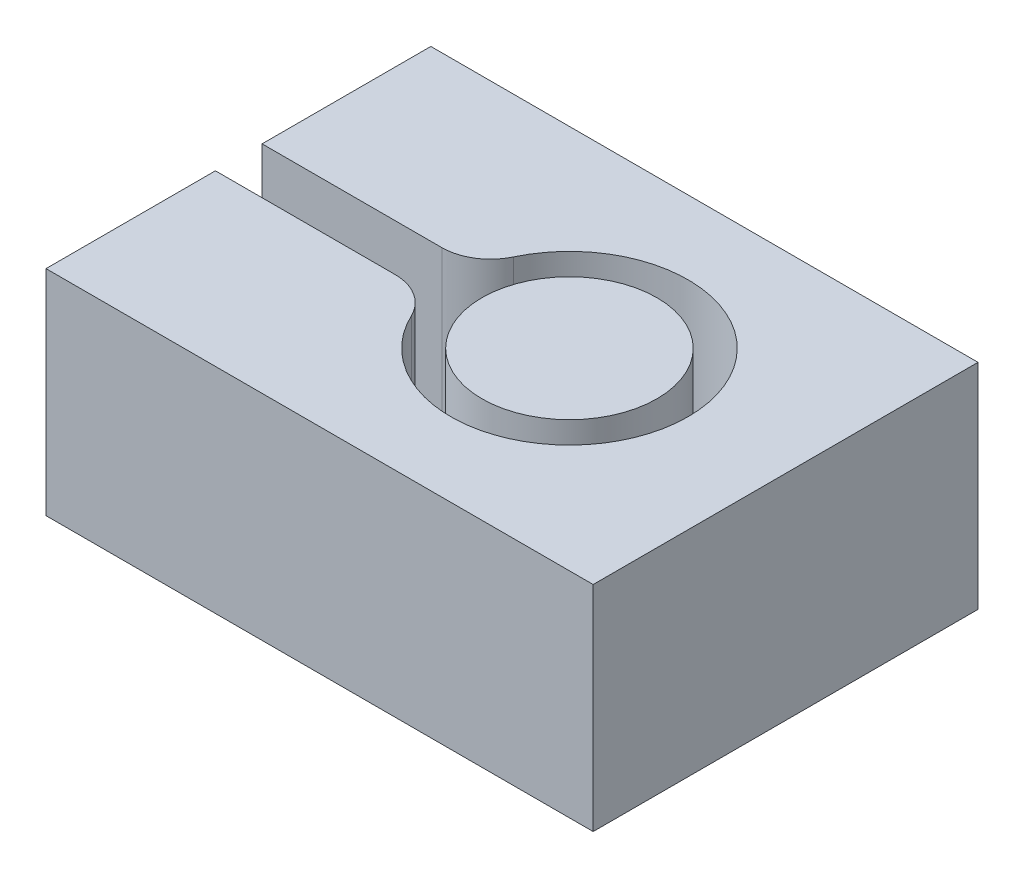
ISO-10303-21;
HEADER;
FILE_DESCRIPTION(('STEP AP214'),'2;1');
FILE_NAME('part.step','',(''),(''),'','','');
FILE_SCHEMA(('AUTOMOTIVE_DESIGN { 1 0 10303 214 1 1 1 1 }'));
ENDSEC;
DATA;
#1=APPLICATION_CONTEXT('core data for automotive mechanical design processes');
#2=APPLICATION_PROTOCOL_DEFINITION('international standard','automotive_design',2000,#1);
#3=PRODUCT_CONTEXT('',#1,'mechanical');
#4=PRODUCT('Part','Part','',(#3));
#5=PRODUCT_RELATED_PRODUCT_CATEGORY('part','',(#4));
#6=PRODUCT_DEFINITION_FORMATION('','',#4);
#7=PRODUCT_DEFINITION_CONTEXT('part definition',#1,'design');
#8=PRODUCT_DEFINITION('design','',#6,#7);
#9=PRODUCT_DEFINITION_SHAPE('','',#8);
#10=(LENGTH_UNIT() NAMED_UNIT(*) SI_UNIT(.MILLI.,.METRE.));
#11=(NAMED_UNIT(*) PLANE_ANGLE_UNIT() SI_UNIT($,.RADIAN.));
#12=(NAMED_UNIT(*) SI_UNIT($,.STERADIAN.) SOLID_ANGLE_UNIT());
#13=UNCERTAINTY_MEASURE_WITH_UNIT(LENGTH_MEASURE(1.E-05),#10,'distance_accuracy_value','');
#14=(GEOMETRIC_REPRESENTATION_CONTEXT(3) GLOBAL_UNCERTAINTY_ASSIGNED_CONTEXT((#13)) GLOBAL_UNIT_ASSIGNED_CONTEXT((#10,
#11,#12)) REPRESENTATION_CONTEXT('',''));
#15=CARTESIAN_POINT('',(0.,0.,0.));
#16=DIRECTION('',(0.,0.,1.));
#17=DIRECTION('',(1.,0.,0.));
#18=AXIS2_PLACEMENT_3D('',#15,#16,#17);
#19=CARTESIAN_POINT('',(0.,0.,0.));
#20=DIRECTION('',(0.,-1.,0.));
#21=DIRECTION('',(0.,0.,-1.));
#22=AXIS2_PLACEMENT_3D('',#19,#20,#21);
#23=PLANE('',#22);
#24=CARTESIAN_POINT('',(17.,0.,-9.90872659824433));
#25=DIRECTION('',(0.,-1.,0.));
#26=DIRECTION('',(0.,0.,-1.));
#27=AXIS2_PLACEMENT_3D('',#24,#25,#26);
#28=CIRCLE('',#27,4.5);
#29=CARTESIAN_POINT('',(17.,0.,-14.4087265982443));
#30=VERTEX_POINT('',#29);
#31=EDGE_CURVE('E12',#30,#30,#28,.F.);
#32=ORIENTED_EDGE('',*,*,#31,.F.);
#33=EDGE_LOOP('',(#32));
#34=FACE_BOUND('',#33,.T.);
#35=DIRECTION('',(1.,0.,0.));
#36=VECTOR('',#35,1.);
#37=CARTESIAN_POINT('',(0.,0.,-8.70872659824433));
#38=LINE('',#37,#36);
#39=CARTESIAN_POINT('',(0.,0.,-8.70872659824433));
#40=VERTEX_POINT('',#39);
#41=CARTESIAN_POINT('',(9.23662444551341,0.,-8.70872659824433));
#42=VERTEX_POINT('',#41);
#43=EDGE_CURVE('E83',#40,#42,#38,.T.);
#44=ORIENTED_EDGE('',*,*,#43,.T.);
#45=CARTESIAN_POINT('',(9.23662444551341,0.,-6.20872659824433));
#46=DIRECTION('',(0.,-1.,0.));
#47=DIRECTION('',(0.,0.,-1.));
#48=AXIS2_PLACEMENT_3D('',#45,#46,#47);
#49=CIRCLE('',#48,2.5);
#50=CARTESIAN_POINT('',(11.4934196648409,0.,-7.28430799359317));
#51=VERTEX_POINT('',#50);
#52=EDGE_CURVE('E173',#51,#42,#49,.F.);
#53=ORIENTED_EDGE('',*,*,#52,.F.);
#54=CARTESIAN_POINT('',(17.,0.,-9.90872659824433));
#55=DIRECTION('',(0.,1.,0.));
#56=DIRECTION('',(0.,0.,1.));
#57=AXIS2_PLACEMENT_3D('',#54,#55,#56);
#58=CIRCLE('',#57,6.1);
#59=CARTESIAN_POINT('',(11.4934196648409,0.,-12.5331452028955));
#60=VERTEX_POINT('',#59);
#61=EDGE_CURVE('E219',#51,#60,#58,.T.);
#62=ORIENTED_EDGE('',*,*,#61,.T.);
#63=CARTESIAN_POINT('',(9.23662444551341,0.,-13.6087265982443));
#64=DIRECTION('',(0.,-1.,0.));
#65=DIRECTION('',(0.,0.,-1.));
#66=AXIS2_PLACEMENT_3D('',#63,#64,#65);
#67=CIRCLE('',#66,2.5);
#68=CARTESIAN_POINT('',(9.23662444551341,0.,-11.1087265982443));
#69=VERTEX_POINT('',#68);
#70=EDGE_CURVE('E181',#60,#69,#67,.T.);
#71=ORIENTED_EDGE('',*,*,#70,.T.);
#72=DIRECTION('',(1.,0.,0.));
#73=VECTOR('',#72,1.);
#74=CARTESIAN_POINT('',(0.,0.,-11.1087265982443));
#75=LINE('',#74,#73);
#76=CARTESIAN_POINT('',(0.,0.,-11.1087265982443));
#77=VERTEX_POINT('',#76);
#78=EDGE_CURVE('E186',#77,#69,#75,.T.);
#79=ORIENTED_EDGE('',*,*,#78,.F.);
#80=DIRECTION('',(0.,0.,-1.));
#81=VECTOR('',#80,1.);
#82=CARTESIAN_POINT('',(0.,0.,-19.7830272925356));
#83=LINE('',#82,#81);
#84=EDGE_CURVE('E88',#40,#77,#83,.T.);
#85=ORIENTED_EDGE('',*,*,#84,.F.);
#86=EDGE_LOOP('',(#44,#53,#62,#71,#79,#85));
#87=FACE_BOUND('',#86,.T.);
#88=ADVANCED_FACE('F68',(#34,#87),#23,.F.);
#89=CARTESIAN_POINT('',(17.,8.,-9.90872659824433));
#90=DIRECTION('',(0.,-1.,0.));
#91=DIRECTION('',(0.,0.,-1.));
#92=AXIS2_PLACEMENT_3D('',#89,#90,#91);
#93=CYLINDRICAL_SURFACE('',#92,6.1);
#94=ORIENTED_EDGE('',*,*,#61,.F.);
#95=DIRECTION('',(0.,1.,0.));
#96=VECTOR('',#95,1.);
#97=CARTESIAN_POINT('',(11.4934196648409,-11.8382282343721,-7.28430799359317));
#98=LINE('',#97,#96);
#99=CARTESIAN_POINT('',(11.4934196648409,8.,-7.28430799359317));
#100=VERTEX_POINT('',#99);
#101=EDGE_CURVE('E166',#51,#100,#98,.T.);
#102=ORIENTED_EDGE('',*,*,#101,.T.);
#103=CARTESIAN_POINT('',(17.,8.,-9.90872659824433));
#104=DIRECTION('',(0.,1.,0.));
#105=DIRECTION('',(0.,0.,1.));
#106=AXIS2_PLACEMENT_3D('',#103,#104,#105);
#107=CIRCLE('',#106,6.1);
#108=CARTESIAN_POINT('',(11.4934196648409,8.,-12.5331452028955));
#109=VERTEX_POINT('',#108);
#110=EDGE_CURVE('E153',#100,#109,#107,.T.);
#111=ORIENTED_EDGE('',*,*,#110,.T.);
#112=DIRECTION('',(0.,1.,0.));
#113=VECTOR('',#112,1.);
#114=CARTESIAN_POINT('',(11.4934196648409,-11.8382282343721,-12.5331452028955));
#115=LINE('',#114,#113);
#116=EDGE_CURVE('E169',#60,#109,#115,.T.);
#117=ORIENTED_EDGE('',*,*,#116,.F.);
#118=EDGE_LOOP('',(#94,#102,#111,#117));
#119=FACE_BOUND('',#118,.T.);
#120=ADVANCED_FACE('F70',(#119),#93,.F.);
#121=CARTESIAN_POINT('',(0.,8.,0.));
#122=DIRECTION('',(0.,0.,-1.));
#123=DIRECTION('',(-1.,0.,0.));
#124=AXIS2_PLACEMENT_3D('',#121,#122,#123);
#125=PLANE('',#124);
#126=DIRECTION('',(0.,-1.,0.));
#127=VECTOR('',#126,1.);
#128=CARTESIAN_POINT('',(0.,8.,0.));
#129=LINE('',#128,#127);
#130=CARTESIAN_POINT('',(0.,8.,0.));
#131=VERTEX_POINT('',#130);
#132=CARTESIAN_POINT('',(0.,-3.,0.));
#133=VERTEX_POINT('',#132);
#134=EDGE_CURVE('E76',#131,#133,#129,.T.);
#135=ORIENTED_EDGE('',*,*,#134,.T.);
#136=DIRECTION('',(-1.,0.,0.));
#137=VECTOR('',#136,1.);
#138=CARTESIAN_POINT('',(25.1281470654807,-3.,0.));
#139=LINE('',#138,#137);
#140=CARTESIAN_POINT('',(28.1281470654807,-3.,0.));
#141=VERTEX_POINT('',#140);
#142=EDGE_CURVE('E211',#141,#133,#139,.T.);
#143=ORIENTED_EDGE('',*,*,#142,.F.);
#144=DIRECTION('',(0.,-1.,0.));
#145=VECTOR('',#144,1.);
#146=CARTESIAN_POINT('',(28.1281470654807,8.,0.));
#147=LINE('',#146,#145);
#148=CARTESIAN_POINT('',(28.1281470654807,8.,0.));
#149=VERTEX_POINT('',#148);
#150=EDGE_CURVE('E199',#149,#141,#147,.T.);
#151=ORIENTED_EDGE('',*,*,#150,.F.);
#152=DIRECTION('',(1.,0.,0.));
#153=VECTOR('',#152,1.);
#154=CARTESIAN_POINT('',(0.,8.,0.));
#155=LINE('',#154,#153);
#156=EDGE_CURVE('E152',#131,#149,#155,.T.);
#157=ORIENTED_EDGE('',*,*,#156,.F.);
#158=EDGE_LOOP('',(#135,#143,#151,#157));
#159=FACE_BOUND('',#158,.T.);
#160=ADVANCED_FACE('F228',(#159),#125,.F.);
#161=CARTESIAN_POINT('',(0.,8.,-19.7830272925356));
#162=DIRECTION('',(0.,0.,-1.));
#163=DIRECTION('',(-1.,0.,0.));
#164=AXIS2_PLACEMENT_3D('',#161,#162,#163);
#165=PLANE('',#164);
#166=DIRECTION('',(1.,0.,0.));
#167=VECTOR('',#166,1.);
#168=CARTESIAN_POINT('',(0.,8.,-19.7830272925356));
#169=LINE('',#168,#167);
#170=CARTESIAN_POINT('',(0.,8.,-19.7830272925356));
#171=VERTEX_POINT('',#170);
#172=CARTESIAN_POINT('',(28.1281470654807,8.,-19.7830272925356));
#173=VERTEX_POINT('',#172);
#174=EDGE_CURVE('E223',#171,#173,#169,.T.);
#175=ORIENTED_EDGE('',*,*,#174,.T.);
#176=DIRECTION('',(0.,1.,0.));
#177=VECTOR('',#176,1.);
#178=CARTESIAN_POINT('',(28.1281470654807,-3.,-19.7830272925356));
#179=LINE('',#178,#177);
#180=CARTESIAN_POINT('',(28.1281470654807,-3.,-19.7830272925356));
#181=VERTEX_POINT('',#180);
#182=EDGE_CURVE('E205',#181,#173,#179,.T.);
#183=ORIENTED_EDGE('',*,*,#182,.F.);
#184=DIRECTION('',(1.,0.,0.));
#185=VECTOR('',#184,1.);
#186=CARTESIAN_POINT('',(25.1281470654807,-3.,-19.7830272925356));
#187=LINE('',#186,#185);
#188=CARTESIAN_POINT('',(0.,-3.,-19.7830272925356));
#189=VERTEX_POINT('',#188);
#190=EDGE_CURVE('E217',#189,#181,#187,.T.);
#191=ORIENTED_EDGE('',*,*,#190,.F.);
#192=DIRECTION('',(0.,-1.,0.));
#193=VECTOR('',#192,1.);
#194=CARTESIAN_POINT('',(0.,8.,-19.7830272925356));
#195=LINE('',#194,#193);
#196=EDGE_CURVE('E226',#171,#189,#195,.T.);
#197=ORIENTED_EDGE('',*,*,#196,.F.);
#198=EDGE_LOOP('',(#175,#183,#191,#197));
#199=FACE_BOUND('',#198,.T.);
#200=ADVANCED_FACE('F237',(#199),#165,.T.);
#201=CARTESIAN_POINT('',(0.,8.,0.));
#202=DIRECTION('',(1.,0.,0.));
#203=DIRECTION('',(0.,0.,-1.));
#204=AXIS2_PLACEMENT_3D('',#201,#202,#203);
#205=PLANE('',#204);
#206=ORIENTED_EDGE('',*,*,#196,.T.);
#207=DIRECTION('',(0.,0.,-1.));
#208=VECTOR('',#207,1.);
#209=CARTESIAN_POINT('',(0.,-3.,-19.7830272925356));
#210=LINE('',#209,#208);
#211=EDGE_CURVE('E214',#133,#189,#210,.T.);
#212=ORIENTED_EDGE('',*,*,#211,.F.);
#213=ORIENTED_EDGE('',*,*,#134,.F.);
#214=DIRECTION('',(0.,0.,1.));
#215=VECTOR('',#214,1.);
#216=CARTESIAN_POINT('',(0.,8.,0.));
#217=LINE('',#216,#215);
#218=CARTESIAN_POINT('',(0.,8.,-8.70872659824433));
#219=VERTEX_POINT('',#218);
#220=EDGE_CURVE('E144',#219,#131,#217,.T.);
#221=ORIENTED_EDGE('',*,*,#220,.F.);
#222=DIRECTION('',(0.,1.,0.));
#223=VECTOR('',#222,1.);
#224=CARTESIAN_POINT('',(0.,-11.8382282343721,-8.70872659824433));
#225=LINE('',#224,#223);
#226=EDGE_CURVE('E147',#40,#219,#225,.T.);
#227=ORIENTED_EDGE('',*,*,#226,.F.);
#228=ORIENTED_EDGE('',*,*,#84,.T.);
#229=DIRECTION('',(0.,1.,0.));
#230=VECTOR('',#229,1.);
#231=CARTESIAN_POINT('',(0.,-11.8382282343721,-11.1087265982443));
#232=LINE('',#231,#230);
#233=CARTESIAN_POINT('',(0.,8.,-11.1087265982443));
#234=VERTEX_POINT('',#233);
#235=EDGE_CURVE('E182',#77,#234,#232,.T.);
#236=ORIENTED_EDGE('',*,*,#235,.T.);
#237=EDGE_CURVE('E155',#171,#234,#217,.T.);
#238=ORIENTED_EDGE('',*,*,#237,.F.);
#239=EDGE_LOOP('',(#206,#212,#213,#221,#227,#228,#236,#238));
#240=FACE_BOUND('',#239,.T.);
#241=ADVANCED_FACE('F146',(#240),#205,.F.);
#242=CARTESIAN_POINT('',(0.,8.,0.));
#243=DIRECTION('',(0.,1.,0.));
#244=DIRECTION('',(0.,0.,1.));
#245=AXIS2_PLACEMENT_3D('',#242,#243,#244);
#246=PLANE('',#245);
#247=ORIENTED_EDGE('',*,*,#237,.T.);
#248=DIRECTION('',(1.,0.,0.));
#249=VECTOR('',#248,1.);
#250=CARTESIAN_POINT('',(0.,8.,-11.1087265982443));
#251=LINE('',#250,#249);
#252=CARTESIAN_POINT('',(9.23662444551341,8.,-11.1087265982443));
#253=VERTEX_POINT('',#252);
#254=EDGE_CURVE('E178',#234,#253,#251,.T.);
#255=ORIENTED_EDGE('',*,*,#254,.T.);
#256=CARTESIAN_POINT('',(9.23662444551341,8.,-13.6087265982443));
#257=DIRECTION('',(0.,1.,0.));
#258=DIRECTION('',(0.,0.,1.));
#259=AXIS2_PLACEMENT_3D('',#256,#257,#258);
#260=CIRCLE('',#259,2.5);
#261=EDGE_CURVE('E183',#109,#253,#260,.F.);
#262=ORIENTED_EDGE('',*,*,#261,.F.);
#263=ORIENTED_EDGE('',*,*,#110,.F.);
#264=CARTESIAN_POINT('',(9.23662444551341,8.,-6.20872659824433));
#265=DIRECTION('',(0.,1.,0.));
#266=DIRECTION('',(0.,0.,1.));
#267=AXIS2_PLACEMENT_3D('',#264,#265,#266);
#268=CIRCLE('',#267,2.5);
#269=CARTESIAN_POINT('',(9.23662444551341,8.,-8.70872659824433));
#270=VERTEX_POINT('',#269);
#271=EDGE_CURVE('E165',#100,#270,#268,.T.);
#272=ORIENTED_EDGE('',*,*,#271,.T.);
#273=DIRECTION('',(1.,0.,0.));
#274=VECTOR('',#273,1.);
#275=CARTESIAN_POINT('',(0.,8.,-8.70872659824433));
#276=LINE('',#275,#274);
#277=EDGE_CURVE('E159',#219,#270,#276,.T.);
#278=ORIENTED_EDGE('',*,*,#277,.F.);
#279=ORIENTED_EDGE('',*,*,#220,.T.);
#280=ORIENTED_EDGE('',*,*,#156,.T.);
#281=DIRECTION('',(0.,0.,1.));
#282=VECTOR('',#281,1.);
#283=CARTESIAN_POINT('',(28.1281470654807,8.,-19.7830272925356));
#284=LINE('',#283,#282);
#285=EDGE_CURVE('E191',#173,#149,#284,.T.);
#286=ORIENTED_EDGE('',*,*,#285,.F.);
#287=ORIENTED_EDGE('',*,*,#174,.F.);
#288=EDGE_LOOP('',(#247,#255,#262,#263,#272,#278,#279,#280,#286,#287));
#289=FACE_BOUND('',#288,.T.);
#290=ADVANCED_FACE('F163',(#289),#246,.T.);
#291=CARTESIAN_POINT('',(0.,-3.,0.));
#292=DIRECTION('',(0.,-1.,0.));
#293=DIRECTION('',(0.,0.,-1.));
#294=AXIS2_PLACEMENT_3D('',#291,#292,#293);
#295=PLANE('',#294);
#296=ORIENTED_EDGE('',*,*,#190,.T.);
#297=DIRECTION('',(0.,0.,-1.));
#298=VECTOR('',#297,1.);
#299=CARTESIAN_POINT('',(28.1281470654807,-3.,0.));
#300=LINE('',#299,#298);
#301=EDGE_CURVE('E202',#141,#181,#300,.T.);
#302=ORIENTED_EDGE('',*,*,#301,.F.);
#303=ORIENTED_EDGE('',*,*,#142,.T.);
#304=ORIENTED_EDGE('',*,*,#211,.T.);
#305=EDGE_LOOP('',(#296,#302,#303,#304));
#306=FACE_BOUND('',#305,.T.);
#307=ADVANCED_FACE('F232',(#306),#295,.T.);
#308=CARTESIAN_POINT('',(17.,8.,-9.90872659824433));
#309=DIRECTION('',(0.,-1.,0.));
#310=DIRECTION('',(0.,0.,-1.));
#311=AXIS2_PLACEMENT_3D('',#308,#309,#310);
#312=CYLINDRICAL_SURFACE('',#311,4.5);
#313=CARTESIAN_POINT('',(17.,8.,-9.90872659824433));
#314=DIRECTION('',(0.,1.,0.));
#315=DIRECTION('',(0.,0.,1.));
#316=AXIS2_PLACEMENT_3D('',#313,#314,#315);
#317=CIRCLE('',#316,4.5);
#318=CARTESIAN_POINT('',(17.,8.,-5.40872659824433));
#319=VERTEX_POINT('',#318);
#320=EDGE_CURVE('E208',#319,#319,#317,.T.);
#321=ORIENTED_EDGE('',*,*,#320,.F.);
#322=EDGE_LOOP('',(#321));
#323=FACE_BOUND('',#322,.T.);
#324=ORIENTED_EDGE('',*,*,#31,.T.);
#325=EDGE_LOOP('',(#324));
#326=FACE_BOUND('',#325,.T.);
#327=ADVANCED_FACE('F287',(#323,#326),#312,.T.);
#328=CARTESIAN_POINT('',(0.,8.,0.));
#329=DIRECTION('',(0.,1.,0.));
#330=DIRECTION('',(0.,0.,1.));
#331=AXIS2_PLACEMENT_3D('',#328,#329,#330);
#332=PLANE('',#331);
#333=ORIENTED_EDGE('',*,*,#320,.T.);
#334=EDGE_LOOP('',(#333));
#335=FACE_BOUND('',#334,.T.);
#336=ADVANCED_FACE('F293',(#335),#332,.T.);
#337=CARTESIAN_POINT('',(28.1281470654807,0.,0.));
#338=DIRECTION('',(1.,0.,0.));
#339=DIRECTION('',(0.,0.,-1.));
#340=AXIS2_PLACEMENT_3D('',#337,#338,#339);
#341=PLANE('',#340);
#342=ORIENTED_EDGE('',*,*,#285,.T.);
#343=ORIENTED_EDGE('',*,*,#150,.T.);
#344=ORIENTED_EDGE('',*,*,#301,.T.);
#345=ORIENTED_EDGE('',*,*,#182,.T.);
#346=EDGE_LOOP('',(#342,#343,#344,#345));
#347=FACE_BOUND('',#346,.T.);
#348=ADVANCED_FACE('F240',(#347),#341,.T.);
#349=CARTESIAN_POINT('',(9.23662444551341,-11.8382282343721,-13.6087265982443));
#350=DIRECTION('',(0.,1.,0.));
#351=DIRECTION('',(0.,0.,1.));
#352=AXIS2_PLACEMENT_3D('',#349,#350,#351);
#353=CYLINDRICAL_SURFACE('',#352,2.5);
#354=ORIENTED_EDGE('',*,*,#70,.F.);
#355=ORIENTED_EDGE('',*,*,#116,.T.);
#356=ORIENTED_EDGE('',*,*,#261,.T.);
#357=DIRECTION('',(0.,1.,0.));
#358=VECTOR('',#357,1.);
#359=CARTESIAN_POINT('',(9.23662444551341,-11.8382282343721,-11.1087265982443));
#360=LINE('',#359,#358);
#361=EDGE_CURVE('E189',#69,#253,#360,.T.);
#362=ORIENTED_EDGE('',*,*,#361,.F.);
#363=EDGE_LOOP('',(#354,#355,#356,#362));
#364=FACE_BOUND('',#363,.T.);
#365=ADVANCED_FACE('F250',(#364),#353,.T.);
#366=CARTESIAN_POINT('',(0.,-11.8382282343721,-11.1087265982443));
#367=DIRECTION('',(0.,0.,1.));
#368=DIRECTION('',(1.,0.,0.));
#369=AXIS2_PLACEMENT_3D('',#366,#367,#368);
#370=PLANE('',#369);
#371=ORIENTED_EDGE('',*,*,#235,.F.);
#372=ORIENTED_EDGE('',*,*,#78,.T.);
#373=ORIENTED_EDGE('',*,*,#361,.T.);
#374=ORIENTED_EDGE('',*,*,#254,.F.);
#375=EDGE_LOOP('',(#371,#372,#373,#374));
#376=FACE_BOUND('',#375,.T.);
#377=ADVANCED_FACE('F246',(#376),#370,.T.);
#378=CARTESIAN_POINT('',(9.23662444551341,-11.8382282343721,-6.20872659824433));
#379=DIRECTION('',(0.,1.,0.));
#380=DIRECTION('',(0.,0.,1.));
#381=AXIS2_PLACEMENT_3D('',#378,#379,#380);
#382=CYLINDRICAL_SURFACE('',#381,2.5);
#383=ORIENTED_EDGE('',*,*,#101,.F.);
#384=ORIENTED_EDGE('',*,*,#52,.T.);
#385=DIRECTION('',(0.,1.,0.));
#386=VECTOR('',#385,1.);
#387=CARTESIAN_POINT('',(9.23662444551341,-11.8382282343721,-8.70872659824433));
#388=LINE('',#387,#386);
#389=EDGE_CURVE('E161',#42,#270,#388,.T.);
#390=ORIENTED_EDGE('',*,*,#389,.T.);
#391=ORIENTED_EDGE('',*,*,#271,.F.);
#392=EDGE_LOOP('',(#383,#384,#390,#391));
#393=FACE_BOUND('',#392,.T.);
#394=ADVANCED_FACE('F255',(#393),#382,.T.);
#395=CARTESIAN_POINT('',(0.,-11.8382282343721,-8.70872659824433));
#396=DIRECTION('',(0.,0.,1.));
#397=DIRECTION('',(1.,0.,0.));
#398=AXIS2_PLACEMENT_3D('',#395,#396,#397);
#399=PLANE('',#398);
#400=ORIENTED_EDGE('',*,*,#43,.F.);
#401=ORIENTED_EDGE('',*,*,#226,.T.);
#402=ORIENTED_EDGE('',*,*,#277,.T.);
#403=ORIENTED_EDGE('',*,*,#389,.F.);
#404=EDGE_LOOP('',(#400,#401,#402,#403));
#405=FACE_BOUND('',#404,.T.);
#406=ADVANCED_FACE('F158',(#405),#399,.F.);
#407=CLOSED_SHELL('',(#88,#120,#160,#200,#241,#290,#307,#327,#336,#348,#365,#377,#394,#406));
#408=MANIFOLD_SOLID_BREP('B2',#407);
#409=ADVANCED_BREP_SHAPE_REPRESENTATION('',(#18,#408),#14);
#410=SHAPE_DEFINITION_REPRESENTATION(#9,#409);
ENDSEC;
END-ISO-10303-21;
